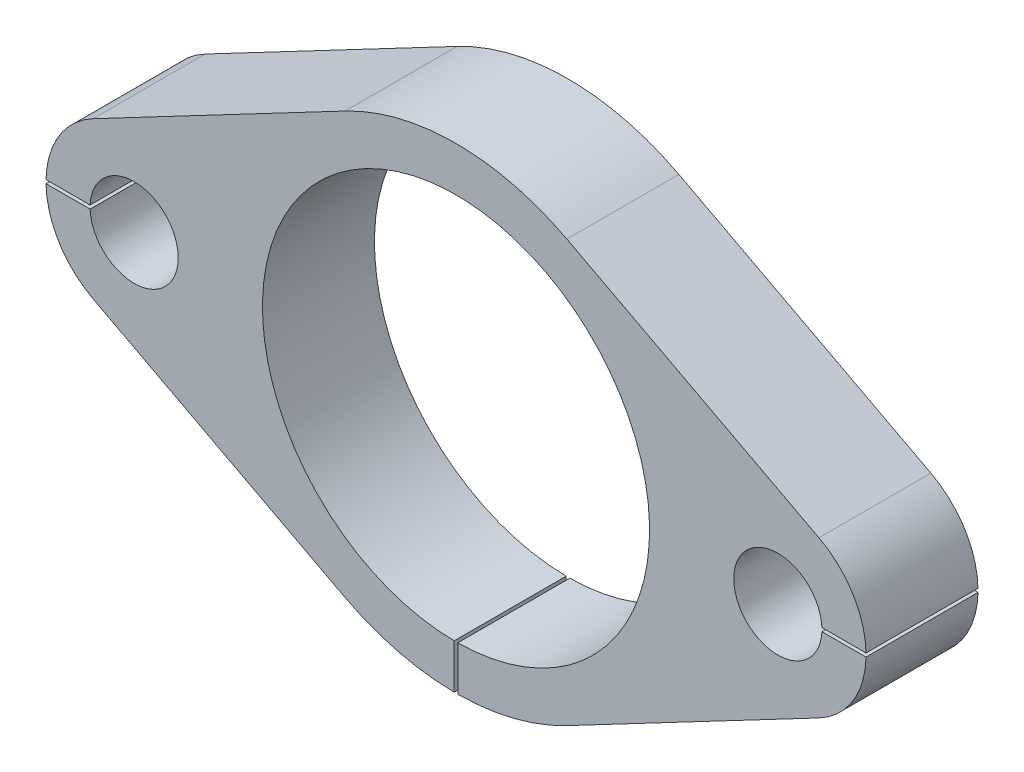
ISO-10303-21;
HEADER;
FILE_DESCRIPTION(('STEP AP214'),'2;1');
FILE_NAME('part.step','',(''),(''),'','','');
FILE_SCHEMA(('AUTOMOTIVE_DESIGN { 1 0 10303 214 1 1 1 1 }'));
ENDSEC;
DATA;
#1=APPLICATION_CONTEXT('core data for automotive mechanical design processes');
#2=APPLICATION_PROTOCOL_DEFINITION('international standard','automotive_design',2000,#1);
#3=PRODUCT_CONTEXT('',#1,'mechanical');
#4=PRODUCT('Part','Part','',(#3));
#5=PRODUCT_RELATED_PRODUCT_CATEGORY('part','',(#4));
#6=PRODUCT_DEFINITION_FORMATION('','',#4);
#7=PRODUCT_DEFINITION_CONTEXT('part definition',#1,'design');
#8=PRODUCT_DEFINITION('design','',#6,#7);
#9=PRODUCT_DEFINITION_SHAPE('','',#8);
#10=(LENGTH_UNIT() NAMED_UNIT(*) SI_UNIT(.MILLI.,.METRE.));
#11=(NAMED_UNIT(*) PLANE_ANGLE_UNIT() SI_UNIT($,.RADIAN.));
#12=(NAMED_UNIT(*) SI_UNIT($,.STERADIAN.) SOLID_ANGLE_UNIT());
#13=UNCERTAINTY_MEASURE_WITH_UNIT(LENGTH_MEASURE(1.E-05),#10,'distance_accuracy_value','');
#14=(GEOMETRIC_REPRESENTATION_CONTEXT(3) GLOBAL_UNCERTAINTY_ASSIGNED_CONTEXT((#13)) GLOBAL_UNIT_ASSIGNED_CONTEXT((#10,
#11,#12)) REPRESENTATION_CONTEXT('',''));
#15=CARTESIAN_POINT('',(0.,0.,0.));
#16=DIRECTION('',(0.,0.,1.));
#17=DIRECTION('',(1.,0.,0.));
#18=AXIS2_PLACEMENT_3D('',#15,#16,#17);
#19=CARTESIAN_POINT('',(18.25,0.,6.35));
#20=DIRECTION('',(0.,0.,-1.));
#21=DIRECTION('',(-1.,0.,0.));
#22=AXIS2_PLACEMENT_3D('',#19,#20,#21);
#23=CYLINDRICAL_SURFACE('',#22,5.);
#24=DIRECTION('',(0.,0.,-1.));
#25=VECTOR('',#24,1.);
#26=CARTESIAN_POINT('',(23.24899989998,-0.100000000000002,6.35));
#27=LINE('',#26,#25);
#28=CARTESIAN_POINT('',(23.24899989998,-0.100000000000002,6.35));
#29=VERTEX_POINT('',#28);
#30=CARTESIAN_POINT('',(23.24899989998,-0.100000000000002,0.));
#31=VERTEX_POINT('',#30);
#32=EDGE_CURVE('E175',#29,#31,#27,.T.);
#33=ORIENTED_EDGE('',*,*,#32,.F.);
#34=CARTESIAN_POINT('',(18.25,0.,6.35));
#35=DIRECTION('',(0.,0.,1.));
#36=DIRECTION('',(1.,0.,0.));
#37=AXIS2_PLACEMENT_3D('',#34,#35,#36);
#38=CIRCLE('',#37,5.);
#39=CARTESIAN_POINT('',(20.5787671232877,-4.4245727121943,6.35));
#40=VERTEX_POINT('',#39);
#41=EDGE_CURVE('E192',#40,#29,#38,.T.);
#42=ORIENTED_EDGE('',*,*,#41,.F.);
#43=DIRECTION('',(0.,0.,-1.));
#44=VECTOR('',#43,1.);
#45=CARTESIAN_POINT('',(20.5787671232877,-4.4245727121943,6.35));
#46=LINE('',#45,#44);
#47=CARTESIAN_POINT('',(20.5787671232877,-4.4245727121943,0.));
#48=VERTEX_POINT('',#47);
#49=EDGE_CURVE('E238',#40,#48,#46,.T.);
#50=ORIENTED_EDGE('',*,*,#49,.T.);
#51=CARTESIAN_POINT('',(18.25,0.,0.));
#52=DIRECTION('',(0.,0.,1.));
#53=DIRECTION('',(1.,0.,0.));
#54=AXIS2_PLACEMENT_3D('',#51,#52,#53);
#55=CIRCLE('',#54,5.);
#56=EDGE_CURVE('E219',#48,#31,#55,.T.);
#57=ORIENTED_EDGE('',*,*,#56,.T.);
#58=EDGE_LOOP('',(#33,#42,#50,#57));
#59=FACE_BOUND('',#58,.T.);
#60=ADVANCED_FACE('F34',(#59),#23,.T.);
#61=DIRECTION('',(0.,0.,-1.));
#62=VECTOR('',#61,1.);
#63=CARTESIAN_POINT('',(23.24899989998,0.0999999999999985,6.35));
#64=LINE('',#63,#62);
#65=CARTESIAN_POINT('',(23.24899989998,0.0999999999999985,0.));
#66=VERTEX_POINT('',#65);
#67=CARTESIAN_POINT('',(23.24899989998,0.0999999999999985,6.35));
#68=VERTEX_POINT('',#67);
#69=EDGE_CURVE('E168',#66,#68,#64,.F.);
#70=ORIENTED_EDGE('',*,*,#69,.F.);
#71=CARTESIAN_POINT('',(20.5787671232877,4.42457271219432,0.));
#72=VERTEX_POINT('',#71);
#73=EDGE_CURVE('E218',#66,#72,#55,.T.);
#74=ORIENTED_EDGE('',*,*,#73,.T.);
#75=DIRECTION('',(0.,0.,-1.));
#76=VECTOR('',#75,1.);
#77=CARTESIAN_POINT('',(20.5787671232877,4.42457271219432,6.35));
#78=LINE('',#77,#76);
#79=CARTESIAN_POINT('',(20.5787671232877,4.42457271219432,6.35));
#80=VERTEX_POINT('',#79);
#81=EDGE_CURVE('E190',#80,#72,#78,.T.);
#82=ORIENTED_EDGE('',*,*,#81,.F.);
#83=EDGE_CURVE('E181',#68,#80,#38,.T.);
#84=ORIENTED_EDGE('',*,*,#83,.F.);
#85=EDGE_LOOP('',(#70,#74,#82,#84));
#86=FACE_BOUND('',#85,.T.);
#87=ADVANCED_FACE('F188',(#86),#23,.T.);
#88=CARTESIAN_POINT('',(-18.25,0.,6.35));
#89=DIRECTION('',(0.,0.,1.));
#90=DIRECTION('',(1.,0.,0.));
#91=AXIS2_PLACEMENT_3D('',#88,#89,#90);
#92=PLANE('',#91);
#93=ORIENTED_EDGE('',*,*,#41,.T.);
#94=DIRECTION('',(-1.,0.,0.));
#95=VECTOR('',#94,1.);
#96=CARTESIAN_POINT('',(23.25,-0.100000000000002,6.35));
#97=LINE('',#96,#95);
#98=CARTESIAN_POINT('',(20.7479991993594,-0.100000000000002,6.35));
#99=VERTEX_POINT('',#98);
#100=EDGE_CURVE('E186',#29,#99,#97,.T.);
#101=ORIENTED_EDGE('',*,*,#100,.T.);
#102=CARTESIAN_POINT('',(18.25,0.,6.35));
#103=DIRECTION('',(0.,0.,1.));
#104=DIRECTION('',(1.,0.,0.));
#105=AXIS2_PLACEMENT_3D('',#102,#103,#104);
#106=CIRCLE('',#105,2.5);
#107=CARTESIAN_POINT('',(20.7479991993594,0.0999999999999999,6.35));
#108=VERTEX_POINT('',#107);
#109=EDGE_CURVE('E185',#108,#99,#106,.T.);
#110=ORIENTED_EDGE('',*,*,#109,.F.);
#111=DIRECTION('',(1.,0.,0.));
#112=VECTOR('',#111,1.);
#113=CARTESIAN_POINT('',(23.25,0.0999999999999985,6.35));
#114=LINE('',#113,#112);
#115=EDGE_CURVE('E49',#108,#68,#114,.T.);
#116=ORIENTED_EDGE('',*,*,#115,.T.);
#117=ORIENTED_EDGE('',*,*,#83,.T.);
#118=DIRECTION('',(-0.884914542438861,0.465753424657534,0.));
#119=VECTOR('',#118,1.);
#120=CARTESIAN_POINT('',(20.5787671232877,4.42457271219432,6.35));
#121=LINE('',#120,#119);
#122=CARTESIAN_POINT('',(6.28767123287671,11.9463463229246,6.35));
#123=VERTEX_POINT('',#122);
#124=EDGE_CURVE('E195',#80,#123,#121,.T.);
#125=ORIENTED_EDGE('',*,*,#124,.T.);
#126=CARTESIAN_POINT('',(0.,0.,6.35));
#127=DIRECTION('',(0.,0.,1.));
#128=DIRECTION('',(1.,0.,0.));
#129=AXIS2_PLACEMENT_3D('',#126,#127,#128);
#130=CIRCLE('',#129,13.5);
#131=CARTESIAN_POINT('',(-6.28767123287671,11.9463463229246,6.35));
#132=VERTEX_POINT('',#131);
#133=EDGE_CURVE('E201',#123,#132,#130,.T.);
#134=ORIENTED_EDGE('',*,*,#133,.T.);
#135=DIRECTION('',(-0.884914542438861,-0.465753424657534,0.));
#136=VECTOR('',#135,1.);
#137=CARTESIAN_POINT('',(-20.5787671232877,4.42457271219431,6.35));
#138=LINE('',#137,#136);
#139=CARTESIAN_POINT('',(-20.5787671232877,4.42457271219431,6.35));
#140=VERTEX_POINT('',#139);
#141=EDGE_CURVE('E203',#132,#140,#138,.T.);
#142=ORIENTED_EDGE('',*,*,#141,.T.);
#143=CARTESIAN_POINT('',(-18.25,0.,6.35));
#144=DIRECTION('',(0.,0.,1.));
#145=DIRECTION('',(1.,0.,0.));
#146=AXIS2_PLACEMENT_3D('',#143,#144,#145);
#147=CIRCLE('',#146,5.);
#148=CARTESIAN_POINT('',(-23.24899989998,0.0999999999999985,6.35));
#149=VERTEX_POINT('',#148);
#150=EDGE_CURVE('E283',#140,#149,#147,.T.);
#151=ORIENTED_EDGE('',*,*,#150,.T.);
#152=DIRECTION('',(-1.,0.,0.));
#153=VECTOR('',#152,1.);
#154=CARTESIAN_POINT('',(-23.25,0.0999999999999985,6.35));
#155=LINE('',#154,#153);
#156=CARTESIAN_POINT('',(-20.7479991993594,0.1,6.35));
#157=VERTEX_POINT('',#156);
#158=EDGE_CURVE('E318',#157,#149,#155,.T.);
#159=ORIENTED_EDGE('',*,*,#158,.F.);
#160=CARTESIAN_POINT('',(-18.25,0.,6.35));
#161=DIRECTION('',(0.,0.,1.));
#162=DIRECTION('',(1.,0.,0.));
#163=AXIS2_PLACEMENT_3D('',#160,#161,#162);
#164=CIRCLE('',#163,2.5);
#165=CARTESIAN_POINT('',(-20.7479991993594,-0.100000000000002,6.35));
#166=VERTEX_POINT('',#165);
#167=EDGE_CURVE('E264',#166,#157,#164,.T.);
#168=ORIENTED_EDGE('',*,*,#167,.F.);
#169=DIRECTION('',(1.,0.,0.));
#170=VECTOR('',#169,1.);
#171=CARTESIAN_POINT('',(-23.25,-0.100000000000002,6.35));
#172=LINE('',#171,#170);
#173=CARTESIAN_POINT('',(-23.24899989998,-0.100000000000002,6.35));
#174=VERTEX_POINT('',#173);
#175=EDGE_CURVE('E313',#174,#166,#172,.T.);
#176=ORIENTED_EDGE('',*,*,#175,.F.);
#177=CARTESIAN_POINT('',(-20.5787671232877,-4.4245727121943,6.35));
#178=VERTEX_POINT('',#177);
#179=EDGE_CURVE('E228',#174,#178,#147,.T.);
#180=ORIENTED_EDGE('',*,*,#179,.T.);
#181=DIRECTION('',(0.88491454243886,-0.465753424657535,0.));
#182=VECTOR('',#181,1.);
#183=CARTESIAN_POINT('',(-20.5787671232877,-4.4245727121943,6.35));
#184=LINE('',#183,#182);
#185=CARTESIAN_POINT('',(-6.28767123287673,-11.9463463229246,6.35));
#186=VERTEX_POINT('',#185);
#187=EDGE_CURVE('E286',#178,#186,#184,.T.);
#188=ORIENTED_EDGE('',*,*,#187,.T.);
#189=CARTESIAN_POINT('',(0.,0.,6.35));
#190=DIRECTION('',(0.,0.,1.));
#191=DIRECTION('',(1.,0.,0.));
#192=AXIS2_PLACEMENT_3D('',#189,#190,#191);
#193=CIRCLE('',#192,13.5);
#194=CARTESIAN_POINT('',(-0.100000000000006,-13.499629624549,6.35));
#195=VERTEX_POINT('',#194);
#196=EDGE_CURVE('E196',#186,#195,#193,.T.);
#197=ORIENTED_EDGE('',*,*,#196,.T.);
#198=DIRECTION('',(0.,-1.,0.));
#199=VECTOR('',#198,1.);
#200=CARTESIAN_POINT('',(-0.0999999999999987,-10.9745444096782,6.35));
#201=LINE('',#200,#199);
#202=CARTESIAN_POINT('',(-0.0999999999999987,-10.9745444096782,6.35));
#203=VERTEX_POINT('',#202);
#204=EDGE_CURVE('E329',#203,#195,#201,.T.);
#205=ORIENTED_EDGE('',*,*,#204,.F.);
#206=CARTESIAN_POINT('',(0.,0.,6.35));
#207=DIRECTION('',(0.,0.,1.));
#208=DIRECTION('',(1.,0.,0.));
#209=AXIS2_PLACEMENT_3D('',#206,#207,#208);
#210=CIRCLE('',#209,10.975);
#211=CARTESIAN_POINT('',(0.100000000000001,-10.9745444096782,6.35));
#212=VERTEX_POINT('',#211);
#213=EDGE_CURVE('E276',#212,#203,#210,.T.);
#214=ORIENTED_EDGE('',*,*,#213,.F.);
#215=DIRECTION('',(0.,1.,0.));
#216=VECTOR('',#215,1.);
#217=CARTESIAN_POINT('',(0.100000000000001,-10.9745444096782,6.35));
#218=LINE('',#217,#216);
#219=CARTESIAN_POINT('',(0.100000000000002,-13.499629624549,6.35));
#220=VERTEX_POINT('',#219);
#221=EDGE_CURVE('E297',#220,#212,#218,.T.);
#222=ORIENTED_EDGE('',*,*,#221,.F.);
#223=CARTESIAN_POINT('',(6.28767123287672,-11.9463463229246,6.35));
#224=VERTEX_POINT('',#223);
#225=EDGE_CURVE('E287',#220,#224,#193,.T.);
#226=ORIENTED_EDGE('',*,*,#225,.T.);
#227=DIRECTION('',(0.88491454243886,0.465753424657535,0.));
#228=VECTOR('',#227,1.);
#229=CARTESIAN_POINT('',(20.5787671232877,-4.42457271219429,6.35));
#230=LINE('',#229,#228);
#231=EDGE_CURVE('E193',#224,#40,#230,.T.);
#232=ORIENTED_EDGE('',*,*,#231,.T.);
#233=EDGE_LOOP('',(#93,#101,#110,#116,#117,#125,#134,#142,#151,#159,#168,#176,#180,#188,#197,
#205,#214,#222,#226,#232));
#234=FACE_BOUND('',#233,.T.);
#235=ADVANCED_FACE('F180',(#234),#92,.T.);
#236=CARTESIAN_POINT('',(-18.25,0.,0.));
#237=DIRECTION('',(0.,0.,1.));
#238=DIRECTION('',(1.,0.,0.));
#239=AXIS2_PLACEMENT_3D('',#236,#237,#238);
#240=PLANE('',#239);
#241=DIRECTION('',(-1.,0.,0.));
#242=VECTOR('',#241,1.);
#243=CARTESIAN_POINT('',(23.25,-0.100000000000002,0.));
#244=LINE('',#243,#242);
#245=CARTESIAN_POINT('',(20.7479991993594,-0.100000000000002,0.));
#246=VERTEX_POINT('',#245);
#247=EDGE_CURVE('E56',#31,#246,#244,.T.);
#248=ORIENTED_EDGE('',*,*,#247,.F.);
#249=ORIENTED_EDGE('',*,*,#56,.F.);
#250=DIRECTION('',(0.88491454243886,0.465753424657535,0.));
#251=VECTOR('',#250,1.);
#252=CARTESIAN_POINT('',(20.5787671232877,-4.42457271219429,0.));
#253=LINE('',#252,#251);
#254=CARTESIAN_POINT('',(6.28767123287672,-11.9463463229246,0.));
#255=VERTEX_POINT('',#254);
#256=EDGE_CURVE('E216',#255,#48,#253,.T.);
#257=ORIENTED_EDGE('',*,*,#256,.F.);
#258=CARTESIAN_POINT('',(0.,0.,0.));
#259=DIRECTION('',(0.,0.,1.));
#260=DIRECTION('',(1.,0.,0.));
#261=AXIS2_PLACEMENT_3D('',#258,#259,#260);
#262=CIRCLE('',#261,13.5);
#263=CARTESIAN_POINT('',(0.100000000000002,-13.499629624549,0.));
#264=VERTEX_POINT('',#263);
#265=EDGE_CURVE('E212',#264,#255,#262,.T.);
#266=ORIENTED_EDGE('',*,*,#265,.F.);
#267=DIRECTION('',(0.,1.,0.));
#268=VECTOR('',#267,1.);
#269=CARTESIAN_POINT('',(0.100000000000001,-10.9745444096782,0.));
#270=LINE('',#269,#268);
#271=CARTESIAN_POINT('',(0.100000000000001,-10.9745444096782,0.));
#272=VERTEX_POINT('',#271);
#273=EDGE_CURVE('E333',#264,#272,#270,.T.);
#274=ORIENTED_EDGE('',*,*,#273,.T.);
#275=CARTESIAN_POINT('',(0.,0.,0.));
#276=DIRECTION('',(0.,0.,1.));
#277=DIRECTION('',(1.,0.,0.));
#278=AXIS2_PLACEMENT_3D('',#275,#276,#277);
#279=CIRCLE('',#278,10.975);
#280=CARTESIAN_POINT('',(-0.0999999999999987,-10.9745444096782,0.));
#281=VERTEX_POINT('',#280);
#282=EDGE_CURVE('E278',#272,#281,#279,.T.);
#283=ORIENTED_EDGE('',*,*,#282,.T.);
#284=DIRECTION('',(0.,-1.,0.));
#285=VECTOR('',#284,1.);
#286=CARTESIAN_POINT('',(-0.0999999999999987,-10.9745444096782,0.));
#287=LINE('',#286,#285);
#288=CARTESIAN_POINT('',(-0.100000000000006,-13.499629624549,0.));
#289=VERTEX_POINT('',#288);
#290=EDGE_CURVE('E330',#281,#289,#287,.T.);
#291=ORIENTED_EDGE('',*,*,#290,.T.);
#292=CARTESIAN_POINT('',(-6.28767123287673,-11.9463463229246,0.));
#293=VERTEX_POINT('',#292);
#294=EDGE_CURVE('E213',#293,#289,#262,.T.);
#295=ORIENTED_EDGE('',*,*,#294,.F.);
#296=DIRECTION('',(0.88491454243886,-0.465753424657535,0.));
#297=VECTOR('',#296,1.);
#298=CARTESIAN_POINT('',(-20.5787671232877,-4.4245727121943,0.));
#299=LINE('',#298,#297);
#300=CARTESIAN_POINT('',(-20.5787671232877,-4.4245727121943,0.));
#301=VERTEX_POINT('',#300);
#302=EDGE_CURVE('E209',#301,#293,#299,.T.);
#303=ORIENTED_EDGE('',*,*,#302,.F.);
#304=CARTESIAN_POINT('',(-18.25,0.,0.));
#305=DIRECTION('',(0.,0.,1.));
#306=DIRECTION('',(1.,0.,0.));
#307=AXIS2_PLACEMENT_3D('',#304,#305,#306);
#308=CIRCLE('',#307,5.);
#309=CARTESIAN_POINT('',(-23.24899989998,-0.100000000000002,0.));
#310=VERTEX_POINT('',#309);
#311=EDGE_CURVE('E210',#310,#301,#308,.T.);
#312=ORIENTED_EDGE('',*,*,#311,.F.);
#313=DIRECTION('',(1.,0.,0.));
#314=VECTOR('',#313,1.);
#315=CARTESIAN_POINT('',(-23.25,-0.100000000000002,0.));
#316=LINE('',#315,#314);
#317=CARTESIAN_POINT('',(-20.7479991993594,-0.100000000000002,0.));
#318=VERTEX_POINT('',#317);
#319=EDGE_CURVE('E314',#310,#318,#316,.T.);
#320=ORIENTED_EDGE('',*,*,#319,.T.);
#321=CARTESIAN_POINT('',(-18.25,0.,0.));
#322=DIRECTION('',(0.,0.,1.));
#323=DIRECTION('',(1.,0.,0.));
#324=AXIS2_PLACEMENT_3D('',#321,#322,#323);
#325=CIRCLE('',#324,2.5);
#326=CARTESIAN_POINT('',(-20.7479991993594,0.1,0.));
#327=VERTEX_POINT('',#326);
#328=EDGE_CURVE('E267',#318,#327,#325,.T.);
#329=ORIENTED_EDGE('',*,*,#328,.T.);
#330=DIRECTION('',(-1.,0.,0.));
#331=VECTOR('',#330,1.);
#332=CARTESIAN_POINT('',(-23.25,0.0999999999999985,0.));
#333=LINE('',#332,#331);
#334=CARTESIAN_POINT('',(-23.24899989998,0.0999999999999985,0.));
#335=VERTEX_POINT('',#334);
#336=EDGE_CURVE('E317',#327,#335,#333,.T.);
#337=ORIENTED_EDGE('',*,*,#336,.T.);
#338=CARTESIAN_POINT('',(-20.5787671232877,4.42457271219431,0.));
#339=VERTEX_POINT('',#338);
#340=EDGE_CURVE('E206',#339,#335,#308,.T.);
#341=ORIENTED_EDGE('',*,*,#340,.F.);
#342=DIRECTION('',(-0.884914542438861,-0.465753424657534,0.));
#343=VECTOR('',#342,1.);
#344=CARTESIAN_POINT('',(-20.5787671232877,4.42457271219431,0.));
#345=LINE('',#344,#343);
#346=CARTESIAN_POINT('',(-6.28767123287671,11.9463463229246,0.));
#347=VERTEX_POINT('',#346);
#348=EDGE_CURVE('E226',#347,#339,#345,.T.);
#349=ORIENTED_EDGE('',*,*,#348,.F.);
#350=CARTESIAN_POINT('',(0.,0.,0.));
#351=DIRECTION('',(0.,0.,1.));
#352=DIRECTION('',(1.,0.,0.));
#353=AXIS2_PLACEMENT_3D('',#350,#351,#352);
#354=CIRCLE('',#353,13.5);
#355=CARTESIAN_POINT('',(6.28767123287671,11.9463463229246,0.));
#356=VERTEX_POINT('',#355);
#357=EDGE_CURVE('E224',#356,#347,#354,.T.);
#358=ORIENTED_EDGE('',*,*,#357,.F.);
#359=DIRECTION('',(-0.884914542438861,0.465753424657534,0.));
#360=VECTOR('',#359,1.);
#361=CARTESIAN_POINT('',(20.5787671232877,4.42457271219432,0.));
#362=LINE('',#361,#360);
#363=EDGE_CURVE('E222',#72,#356,#362,.T.);
#364=ORIENTED_EDGE('',*,*,#363,.F.);
#365=ORIENTED_EDGE('',*,*,#73,.F.);
#366=DIRECTION('',(1.,0.,0.));
#367=VECTOR('',#366,1.);
#368=CARTESIAN_POINT('',(23.25,0.0999999999999985,0.));
#369=LINE('',#368,#367);
#370=CARTESIAN_POINT('',(20.7479991993594,0.1,0.));
#371=VERTEX_POINT('',#370);
#372=EDGE_CURVE('E171',#371,#66,#369,.T.);
#373=ORIENTED_EDGE('',*,*,#372,.F.);
#374=CARTESIAN_POINT('',(18.25,0.,0.));
#375=DIRECTION('',(0.,0.,1.));
#376=DIRECTION('',(1.,0.,0.));
#377=AXIS2_PLACEMENT_3D('',#374,#375,#376);
#378=CIRCLE('',#377,2.5);
#379=EDGE_CURVE('E260',#371,#246,#378,.T.);
#380=ORIENTED_EDGE('',*,*,#379,.T.);
#381=EDGE_LOOP('',(#248,#249,#257,#266,#274,#283,#291,#295,#303,#312,#320,#329,#337,#341,#349,
#358,#364,#365,#373,#380));
#382=FACE_BOUND('',#381,.T.);
#383=ADVANCED_FACE('F259',(#382),#240,.F.);
#384=CARTESIAN_POINT('',(18.25,0.,0.));
#385=DIRECTION('',(0.,0.,1.));
#386=DIRECTION('',(1.,0.,0.));
#387=AXIS2_PLACEMENT_3D('',#384,#385,#386);
#388=CYLINDRICAL_SURFACE('',#387,2.5);
#389=DIRECTION('',(0.,0.,1.));
#390=VECTOR('',#389,1.);
#391=CARTESIAN_POINT('',(20.7479991993594,-0.100000000000002,0.));
#392=LINE('',#391,#390);
#393=EDGE_CURVE('E11',#246,#99,#392,.T.);
#394=ORIENTED_EDGE('',*,*,#393,.F.);
#395=ORIENTED_EDGE('',*,*,#379,.F.);
#396=DIRECTION('',(0.,0.,1.));
#397=VECTOR('',#396,1.);
#398=CARTESIAN_POINT('',(20.7479991993594,0.1,0.));
#399=LINE('',#398,#397);
#400=EDGE_CURVE('E42',#108,#371,#399,.F.);
#401=ORIENTED_EDGE('',*,*,#400,.F.);
#402=ORIENTED_EDGE('',*,*,#109,.T.);
#403=EDGE_LOOP('',(#394,#395,#401,#402));
#404=FACE_BOUND('',#403,.T.);
#405=ADVANCED_FACE('F263',(#404),#388,.F.);
#406=CARTESIAN_POINT('',(-18.25,0.,6.35));
#407=DIRECTION('',(0.,0.,-1.));
#408=DIRECTION('',(-1.,0.,0.));
#409=AXIS2_PLACEMENT_3D('',#406,#407,#408);
#410=CYLINDRICAL_SURFACE('',#409,5.);
#411=ORIENTED_EDGE('',*,*,#340,.T.);
#412=DIRECTION('',(0.,0.,-1.));
#413=VECTOR('',#412,1.);
#414=CARTESIAN_POINT('',(-23.24899989998,0.0999999999999985,6.35));
#415=LINE('',#414,#413);
#416=EDGE_CURVE('E326',#335,#149,#415,.F.);
#417=ORIENTED_EDGE('',*,*,#416,.T.);
#418=ORIENTED_EDGE('',*,*,#150,.F.);
#419=DIRECTION('',(0.,0.,-1.));
#420=VECTOR('',#419,1.);
#421=CARTESIAN_POINT('',(-20.5787671232877,4.42457271219431,6.35));
#422=LINE('',#421,#420);
#423=EDGE_CURVE('E205',#140,#339,#422,.T.);
#424=ORIENTED_EDGE('',*,*,#423,.T.);
#425=EDGE_LOOP('',(#411,#417,#418,#424));
#426=FACE_BOUND('',#425,.T.);
#427=ADVANCED_FACE('F375',(#426),#410,.T.);
#428=CARTESIAN_POINT('',(0.,0.,6.35));
#429=DIRECTION('',(0.,0.,-1.));
#430=DIRECTION('',(-1.,0.,0.));
#431=AXIS2_PLACEMENT_3D('',#428,#429,#430);
#432=CYLINDRICAL_SURFACE('',#431,13.5);
#433=ORIENTED_EDGE('',*,*,#225,.F.);
#434=DIRECTION('',(0.,0.,1.));
#435=VECTOR('',#434,1.);
#436=CARTESIAN_POINT('',(0.100000000000002,-13.499629624549,0.));
#437=LINE('',#436,#435);
#438=EDGE_CURVE('E340',#264,#220,#437,.T.);
#439=ORIENTED_EDGE('',*,*,#438,.F.);
#440=ORIENTED_EDGE('',*,*,#265,.T.);
#441=DIRECTION('',(0.,0.,-1.));
#442=VECTOR('',#441,1.);
#443=CARTESIAN_POINT('',(6.28767123287672,-11.9463463229246,6.35));
#444=LINE('',#443,#442);
#445=EDGE_CURVE('E241',#224,#255,#444,.T.);
#446=ORIENTED_EDGE('',*,*,#445,.F.);
#447=EDGE_LOOP('',(#433,#439,#440,#446));
#448=FACE_BOUND('',#447,.T.);
#449=ADVANCED_FACE('F300',(#448),#432,.T.);
#450=ORIENTED_EDGE('',*,*,#179,.F.);
#451=DIRECTION('',(0.,0.,-1.));
#452=VECTOR('',#451,1.);
#453=CARTESIAN_POINT('',(-23.24899989998,-0.100000000000002,6.35));
#454=LINE('',#453,#452);
#455=EDGE_CURVE('E321',#174,#310,#454,.T.);
#456=ORIENTED_EDGE('',*,*,#455,.T.);
#457=ORIENTED_EDGE('',*,*,#311,.T.);
#458=DIRECTION('',(0.,0.,-1.));
#459=VECTOR('',#458,1.);
#460=CARTESIAN_POINT('',(-20.5787671232877,-4.4245727121943,6.35));
#461=LINE('',#460,#459);
#462=EDGE_CURVE('E247',#178,#301,#461,.T.);
#463=ORIENTED_EDGE('',*,*,#462,.F.);
#464=EDGE_LOOP('',(#450,#456,#457,#463));
#465=FACE_BOUND('',#464,.T.);
#466=ADVANCED_FACE('F36',(#465),#410,.T.);
#467=CARTESIAN_POINT('',(-20.5787671232877,-4.4245727121943,6.35));
#468=DIRECTION('',(0.465753424657535,0.88491454243886,0.));
#469=DIRECTION('',(-0.884914542438861,0.465753424657535,0.));
#470=AXIS2_PLACEMENT_3D('',#467,#468,#469);
#471=PLANE('',#470);
#472=ORIENTED_EDGE('',*,*,#302,.T.);
#473=DIRECTION('',(0.,0.,-1.));
#474=VECTOR('',#473,1.);
#475=CARTESIAN_POINT('',(-6.28767123287673,-11.9463463229246,6.35));
#476=LINE('',#475,#474);
#477=EDGE_CURVE('E244',#186,#293,#476,.T.);
#478=ORIENTED_EDGE('',*,*,#477,.F.);
#479=ORIENTED_EDGE('',*,*,#187,.F.);
#480=ORIENTED_EDGE('',*,*,#462,.T.);
#481=EDGE_LOOP('',(#472,#478,#479,#480));
#482=FACE_BOUND('',#481,.T.);
#483=ADVANCED_FACE('F358',(#482),#471,.F.);
#484=ORIENTED_EDGE('',*,*,#294,.T.);
#485=DIRECTION('',(0.,0.,1.));
#486=VECTOR('',#485,1.);
#487=CARTESIAN_POINT('',(-0.100000000000006,-13.499629624549,0.));
#488=LINE('',#487,#486);
#489=EDGE_CURVE('E341',#289,#195,#488,.T.);
#490=ORIENTED_EDGE('',*,*,#489,.T.);
#491=ORIENTED_EDGE('',*,*,#196,.F.);
#492=ORIENTED_EDGE('',*,*,#477,.T.);
#493=EDGE_LOOP('',(#484,#490,#491,#492));
#494=FACE_BOUND('',#493,.T.);
#495=ADVANCED_FACE('F354',(#494),#432,.T.);
#496=CARTESIAN_POINT('',(20.5787671232877,-4.42457271219429,6.35));
#497=DIRECTION('',(-0.465753424657535,0.88491454243886,0.));
#498=DIRECTION('',(-0.88491454243886,-0.465753424657535,0.));
#499=AXIS2_PLACEMENT_3D('',#496,#497,#498);
#500=PLANE('',#499);
#501=ORIENTED_EDGE('',*,*,#256,.T.);
#502=ORIENTED_EDGE('',*,*,#49,.F.);
#503=ORIENTED_EDGE('',*,*,#231,.F.);
#504=ORIENTED_EDGE('',*,*,#445,.T.);
#505=EDGE_LOOP('',(#501,#502,#503,#504));
#506=FACE_BOUND('',#505,.T.);
#507=ADVANCED_FACE('F304',(#506),#500,.F.);
#508=CARTESIAN_POINT('',(20.5787671232877,4.42457271219432,6.35));
#509=DIRECTION('',(-0.465753424657534,-0.884914542438861,0.));
#510=DIRECTION('',(0.884914542438861,-0.465753424657534,0.));
#511=AXIS2_PLACEMENT_3D('',#508,#509,#510);
#512=PLANE('',#511);
#513=ORIENTED_EDGE('',*,*,#363,.T.);
#514=DIRECTION('',(0.,0.,-1.));
#515=VECTOR('',#514,1.);
#516=CARTESIAN_POINT('',(6.28767123287671,11.9463463229246,6.35));
#517=LINE('',#516,#515);
#518=EDGE_CURVE('E234',#123,#356,#517,.T.);
#519=ORIENTED_EDGE('',*,*,#518,.F.);
#520=ORIENTED_EDGE('',*,*,#124,.F.);
#521=ORIENTED_EDGE('',*,*,#81,.T.);
#522=EDGE_LOOP('',(#513,#519,#520,#521));
#523=FACE_BOUND('',#522,.T.);
#524=ADVANCED_FACE('F388',(#523),#512,.F.);
#525=CARTESIAN_POINT('',(0.,0.,6.35));
#526=DIRECTION('',(0.,0.,-1.));
#527=DIRECTION('',(-1.,0.,0.));
#528=AXIS2_PLACEMENT_3D('',#525,#526,#527);
#529=CYLINDRICAL_SURFACE('',#528,13.5);
#530=ORIENTED_EDGE('',*,*,#357,.T.);
#531=DIRECTION('',(0.,0.,-1.));
#532=VECTOR('',#531,1.);
#533=CARTESIAN_POINT('',(-6.28767123287671,11.9463463229246,6.35));
#534=LINE('',#533,#532);
#535=EDGE_CURVE('E231',#132,#347,#534,.T.);
#536=ORIENTED_EDGE('',*,*,#535,.F.);
#537=ORIENTED_EDGE('',*,*,#133,.F.);
#538=ORIENTED_EDGE('',*,*,#518,.T.);
#539=EDGE_LOOP('',(#530,#536,#537,#538));
#540=FACE_BOUND('',#539,.T.);
#541=ADVANCED_FACE('F384',(#540),#529,.T.);
#542=CARTESIAN_POINT('',(-20.5787671232877,4.42457271219431,6.35));
#543=DIRECTION('',(0.465753424657534,-0.884914542438861,0.));
#544=DIRECTION('',(0.884914542438861,0.465753424657534,0.));
#545=AXIS2_PLACEMENT_3D('',#542,#543,#544);
#546=PLANE('',#545);
#547=ORIENTED_EDGE('',*,*,#348,.T.);
#548=ORIENTED_EDGE('',*,*,#423,.F.);
#549=ORIENTED_EDGE('',*,*,#141,.F.);
#550=ORIENTED_EDGE('',*,*,#535,.T.);
#551=EDGE_LOOP('',(#547,#548,#549,#550));
#552=FACE_BOUND('',#551,.T.);
#553=ADVANCED_FACE('F380',(#552),#546,.F.);
#554=CARTESIAN_POINT('',(0.,0.,0.));
#555=DIRECTION('',(0.,0.,1.));
#556=DIRECTION('',(1.,0.,0.));
#557=AXIS2_PLACEMENT_3D('',#554,#555,#556);
#558=CYLINDRICAL_SURFACE('',#557,10.975);
#559=ORIENTED_EDGE('',*,*,#282,.F.);
#560=DIRECTION('',(0.,0.,1.));
#561=VECTOR('',#560,1.);
#562=CARTESIAN_POINT('',(0.100000000000001,-10.9745444096782,0.));
#563=LINE('',#562,#561);
#564=EDGE_CURVE('E269',#272,#212,#563,.T.);
#565=ORIENTED_EDGE('',*,*,#564,.T.);
#566=ORIENTED_EDGE('',*,*,#213,.T.);
#567=DIRECTION('',(0.,0.,1.));
#568=VECTOR('',#567,1.);
#569=CARTESIAN_POINT('',(-0.0999999999999987,-10.9745444096782,0.));
#570=LINE('',#569,#568);
#571=EDGE_CURVE('E272',#281,#203,#570,.T.);
#572=ORIENTED_EDGE('',*,*,#571,.F.);
#573=EDGE_LOOP('',(#559,#565,#566,#572));
#574=FACE_BOUND('',#573,.T.);
#575=ADVANCED_FACE('F349',(#574),#558,.F.);
#576=CARTESIAN_POINT('',(-18.25,0.,0.));
#577=DIRECTION('',(0.,0.,1.));
#578=DIRECTION('',(1.,0.,0.));
#579=AXIS2_PLACEMENT_3D('',#576,#577,#578);
#580=CYLINDRICAL_SURFACE('',#579,2.5);
#581=ORIENTED_EDGE('',*,*,#167,.T.);
#582=DIRECTION('',(0.,0.,1.));
#583=VECTOR('',#582,1.);
#584=CARTESIAN_POINT('',(-20.7479991993594,0.1,0.));
#585=LINE('',#584,#583);
#586=EDGE_CURVE('E253',#157,#327,#585,.F.);
#587=ORIENTED_EDGE('',*,*,#586,.T.);
#588=ORIENTED_EDGE('',*,*,#328,.F.);
#589=DIRECTION('',(0.,0.,1.));
#590=VECTOR('',#589,1.);
#591=CARTESIAN_POINT('',(-20.7479991993594,-0.100000000000002,0.));
#592=LINE('',#591,#590);
#593=EDGE_CURVE('E250',#318,#166,#592,.T.);
#594=ORIENTED_EDGE('',*,*,#593,.T.);
#595=EDGE_LOOP('',(#581,#587,#588,#594));
#596=FACE_BOUND('',#595,.T.);
#597=ADVANCED_FACE('F370',(#596),#580,.F.);
#598=CARTESIAN_POINT('',(-0.0999999999999987,-10.9745444096782,0.));
#599=DIRECTION('',(-1.,0.,0.));
#600=DIRECTION('',(0.,-1.,0.));
#601=AXIS2_PLACEMENT_3D('',#598,#599,#600);
#602=PLANE('',#601);
#603=ORIENTED_EDGE('',*,*,#204,.T.);
#604=ORIENTED_EDGE('',*,*,#489,.F.);
#605=ORIENTED_EDGE('',*,*,#290,.F.);
#606=ORIENTED_EDGE('',*,*,#571,.T.);
#607=EDGE_LOOP('',(#603,#604,#605,#606));
#608=FACE_BOUND('',#607,.T.);
#609=ADVANCED_FACE('F346',(#608),#602,.F.);
#610=CARTESIAN_POINT('',(0.100000000000001,-10.9745444096782,0.));
#611=DIRECTION('',(1.,0.,0.));
#612=DIRECTION('',(0.,1.,0.));
#613=AXIS2_PLACEMENT_3D('',#610,#611,#612);
#614=PLANE('',#613);
#615=ORIENTED_EDGE('',*,*,#221,.T.);
#616=ORIENTED_EDGE('',*,*,#564,.F.);
#617=ORIENTED_EDGE('',*,*,#273,.F.);
#618=ORIENTED_EDGE('',*,*,#438,.T.);
#619=EDGE_LOOP('',(#615,#616,#617,#618));
#620=FACE_BOUND('',#619,.T.);
#621=ADVANCED_FACE('F351',(#620),#614,.F.);
#622=CARTESIAN_POINT('',(-23.25,-0.100000000000002,0.));
#623=DIRECTION('',(0.,-1.,0.));
#624=DIRECTION('',(0.,0.,-1.));
#625=AXIS2_PLACEMENT_3D('',#622,#623,#624);
#626=PLANE('',#625);
#627=ORIENTED_EDGE('',*,*,#175,.T.);
#628=ORIENTED_EDGE('',*,*,#593,.F.);
#629=ORIENTED_EDGE('',*,*,#319,.F.);
#630=ORIENTED_EDGE('',*,*,#455,.F.);
#631=EDGE_LOOP('',(#627,#628,#629,#630));
#632=FACE_BOUND('',#631,.T.);
#633=ADVANCED_FACE('F366',(#632),#626,.F.);
#634=CARTESIAN_POINT('',(-23.25,0.0999999999999985,0.));
#635=DIRECTION('',(0.,1.,0.));
#636=DIRECTION('',(-1.,0.,0.));
#637=AXIS2_PLACEMENT_3D('',#634,#635,#636);
#638=PLANE('',#637);
#639=ORIENTED_EDGE('',*,*,#336,.F.);
#640=ORIENTED_EDGE('',*,*,#586,.F.);
#641=ORIENTED_EDGE('',*,*,#158,.T.);
#642=ORIENTED_EDGE('',*,*,#416,.F.);
#643=EDGE_LOOP('',(#639,#640,#641,#642));
#644=FACE_BOUND('',#643,.T.);
#645=ADVANCED_FACE('F460',(#644),#638,.F.);
#646=CARTESIAN_POINT('',(23.25,0.0999999999999985,0.));
#647=DIRECTION('',(0.,-1.,0.));
#648=DIRECTION('',(1.,0.,0.));
#649=AXIS2_PLACEMENT_3D('',#646,#647,#648);
#650=PLANE('',#649);
#651=ORIENTED_EDGE('',*,*,#69,.T.);
#652=ORIENTED_EDGE('',*,*,#115,.F.);
#653=ORIENTED_EDGE('',*,*,#400,.T.);
#654=ORIENTED_EDGE('',*,*,#372,.T.);
#655=EDGE_LOOP('',(#651,#652,#653,#654));
#656=FACE_BOUND('',#655,.T.);
#657=ADVANCED_FACE('F169',(#656),#650,.T.);
#658=CARTESIAN_POINT('',(23.25,-0.100000000000002,0.));
#659=DIRECTION('',(0.,1.,0.));
#660=DIRECTION('',(0.,0.,1.));
#661=AXIS2_PLACEMENT_3D('',#658,#659,#660);
#662=PLANE('',#661);
#663=ORIENTED_EDGE('',*,*,#32,.T.);
#664=ORIENTED_EDGE('',*,*,#247,.T.);
#665=ORIENTED_EDGE('',*,*,#393,.T.);
#666=ORIENTED_EDGE('',*,*,#100,.F.);
#667=EDGE_LOOP('',(#663,#664,#665,#666));
#668=FACE_BOUND('',#667,.T.);
#669=ADVANCED_FACE('F473',(#668),#662,.T.);
#670=CLOSED_SHELL('',(#60,#87,#235,#383,#405,#427,#449,#466,#483,#495,#507,#524,#541,#553,#575,
#597,#609,#621,#633,#645,#657,#669));
#671=MANIFOLD_SOLID_BREP('B2',#670);
#672=ADVANCED_BREP_SHAPE_REPRESENTATION('',(#18,#671),#14);
#673=SHAPE_DEFINITION_REPRESENTATION(#9,#672);
ENDSEC;
END-ISO-10303-21;
